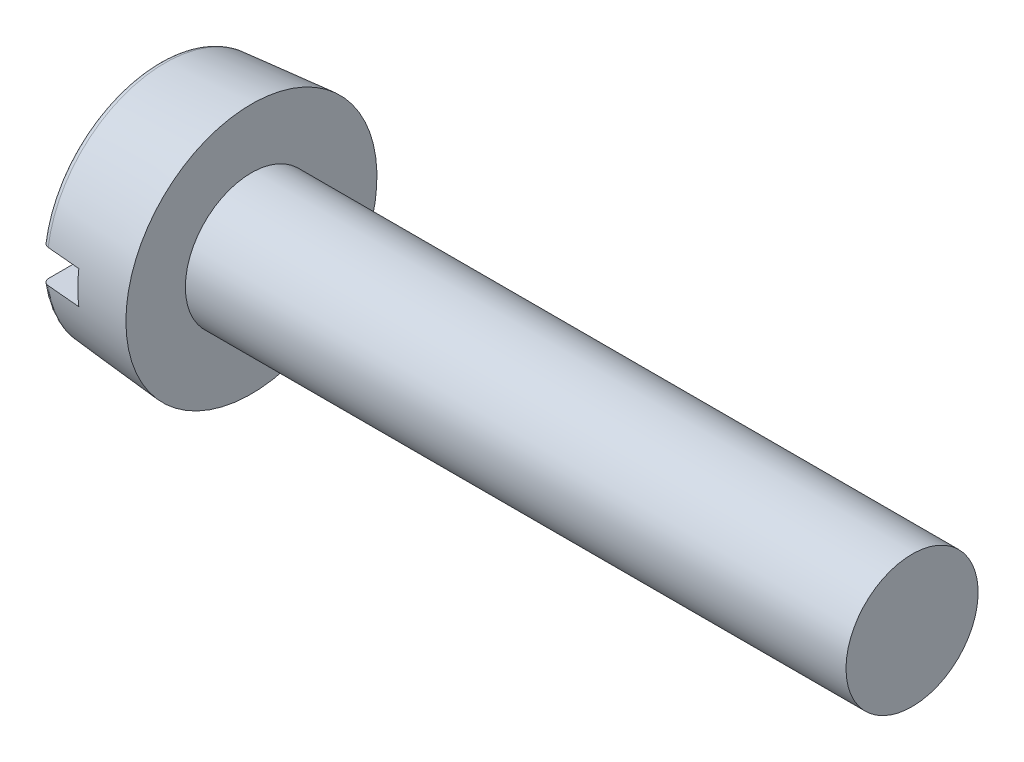
ISO-10303-21;
HEADER;
FILE_DESCRIPTION(('STEP AP214'),'2;1');
FILE_NAME('part.step','',(''),(''),'','','');
FILE_SCHEMA(('AUTOMOTIVE_DESIGN { 1 0 10303 214 1 1 1 1 }'));
ENDSEC;
DATA;
#1=APPLICATION_CONTEXT('core data for automotive mechanical design processes');
#2=APPLICATION_PROTOCOL_DEFINITION('international standard','automotive_design',2000,#1);
#3=PRODUCT_CONTEXT('',#1,'mechanical');
#4=PRODUCT('Part','Part','',(#3));
#5=PRODUCT_RELATED_PRODUCT_CATEGORY('part','',(#4));
#6=PRODUCT_DEFINITION_FORMATION('','',#4);
#7=PRODUCT_DEFINITION_CONTEXT('part definition',#1,'design');
#8=PRODUCT_DEFINITION('design','',#6,#7);
#9=PRODUCT_DEFINITION_SHAPE('','',#8);
#10=(LENGTH_UNIT() NAMED_UNIT(*) SI_UNIT(.MILLI.,.METRE.));
#11=(NAMED_UNIT(*) PLANE_ANGLE_UNIT() SI_UNIT($,.RADIAN.));
#12=(NAMED_UNIT(*) SI_UNIT($,.STERADIAN.) SOLID_ANGLE_UNIT());
#13=UNCERTAINTY_MEASURE_WITH_UNIT(LENGTH_MEASURE(1.E-05),#10,'distance_accuracy_value','');
#14=(GEOMETRIC_REPRESENTATION_CONTEXT(3) GLOBAL_UNCERTAINTY_ASSIGNED_CONTEXT((#13)) GLOBAL_UNIT_ASSIGNED_CONTEXT((#10,
#11,#12)) REPRESENTATION_CONTEXT('',''));
#15=CARTESIAN_POINT('',(0.,0.,0.));
#16=DIRECTION('',(0.,0.,1.));
#17=DIRECTION('',(1.,0.,0.));
#18=AXIS2_PLACEMENT_3D('',#15,#16,#17);
#19=CARTESIAN_POINT('',(0.,0.,0.));
#20=DIRECTION('',(-1.,0.,0.));
#21=DIRECTION('',(0.,0.,1.));
#22=AXIS2_PLACEMENT_3D('',#19,#20,#21);
#23=PLANE('',#22);
#24=DIRECTION('',(0.,0.,-1.));
#25=VECTOR('',#24,1.);
#26=CARTESIAN_POINT('',(0.,0.25,1.9));
#27=LINE('',#26,#25);
#28=CARTESIAN_POINT('',(0.,0.25,1.66724343126456));
#29=VERTEX_POINT('',#28);
#30=CARTESIAN_POINT('',(0.,0.25,-1.66724343126456));
#31=VERTEX_POINT('',#30);
#32=EDGE_CURVE('E84',#29,#31,#27,.T.);
#33=ORIENTED_EDGE('',*,*,#32,.F.);
#34=CARTESIAN_POINT('',(0.,0.,0.));
#35=DIRECTION('',(-1.,0.,0.));
#36=DIRECTION('',(0.,0.,1.));
#37=AXIS2_PLACEMENT_3D('',#34,#35,#36);
#38=CIRCLE('',#37,1.68588275366196);
#39=EDGE_CURVE('E86',#29,#31,#38,.T.);
#40=ORIENTED_EDGE('',*,*,#39,.T.);
#41=EDGE_LOOP('',(#33,#40));
#42=FACE_BOUND('',#41,.T.);
#43=ADVANCED_FACE('F16',(#42),#23,.T.);
#44=CARTESIAN_POINT('',(0.1,0.,0.));
#45=DIRECTION('',(-1.,0.,0.));
#46=DIRECTION('',(0.,0.,1.));
#47=AXIS2_PLACEMENT_3D('',#44,#45,#46);
#48=TOROIDAL_SURFACE('',#47,1.68588275366196,0.1);
#49=CARTESIAN_POINT('',(0.0301239837184526,0.25,-1.73954570987134));
#50=CARTESIAN_POINT('',(0.0341122540256549,0.25,-1.74348114703535));
#51=CARTESIAN_POINT('',(0.0384332916495908,0.25,-1.74708479745269));
#52=CARTESIAN_POINT('',(0.0476215968885681,0.25,-1.75351988324919));
#53=CARTESIAN_POINT('',(0.0524894518418905,0.25,-1.75635047687334));
#54=CARTESIAN_POINT('',(0.0626321269057779,0.25,-1.7611518726827));
#55=CARTESIAN_POINT('',(0.0679068945512783,0.25,-1.76312278549305));
#56=CARTESIAN_POINT('',(0.07871224547132,0.25,-1.76614517825523));
#57=CARTESIAN_POINT('',(0.0842427666888276,0.25,-1.76719688002821));
#58=CARTESIAN_POINT('',(0.0953733944439471,0.25,-1.76834695503076));
#59=CARTESIAN_POINT('',(0.100972999637236,0.25,-1.76845018239128));
#60=CARTESIAN_POINT('',(0.112109811915657,0.25,-1.76771285537891));
#61=CARTESIAN_POINT('',(0.117647018058241,0.25,-1.76687228676909));
#62=CARTESIAN_POINT('',(0.128489803717952,0.25,-1.76427538353904));
#63=CARTESIAN_POINT('',(0.133795848010853,0.25,-1.76252098799906));
#64=CARTESIAN_POINT('',(0.14403973031954,0.25,-1.75814968615088));
#65=CARTESIAN_POINT('',(0.148977564711526,0.25,-1.75553277135542));
#66=CARTESIAN_POINT('',(0.15836674169469,0.25,-1.74950124280131));
#67=CARTESIAN_POINT('',(0.162816088565465,0.25,-1.74608352334629));
#68=CARTESIAN_POINT('',(0.171083921068068,0.25,-1.73855542384798));
#69=CARTESIAN_POINT('',(0.174902382724926,0.25,-1.73444501749311));
#70=CARTESIAN_POINT('',(0.181835504151915,0.25,-1.72561114445745));
#71=CARTESIAN_POINT('',(0.184943867145123,0.25,-1.72088273649891));
#72=CARTESIAN_POINT('',(0.190331805109599,0.25,-1.71097526726483));
#73=CARTESIAN_POINT('',(0.19261133485436,0.25,-1.7057961814165));
#74=CARTESIAN_POINT('',(0.19630050346213,0.25,-1.69507883946751));
#75=CARTESIAN_POINT('',(0.197701208750648,0.25,-1.68953750769915));
#76=CARTESIAN_POINT('',(0.199560107931746,0.25,-1.67829891478366));
#77=CARTESIAN_POINT('',(0.200018256978501,0.25,-1.67260164623029));
#78=CARTESIAN_POINT('',(0.199980488082452,0.25,-1.66116755240173));
#79=CARTESIAN_POINT('',(0.199477416691625,0.25,-1.65543074959807));
#80=CARTESIAN_POINT('',(0.197516883099685,0.25,-1.64412247089109));
#81=CARTESIAN_POINT('',(0.19605940106392,0.25,-1.6385509984262));
#82=CARTESIAN_POINT('',(0.192226434881595,0.25,-1.62772407078967));
#83=CARTESIAN_POINT('',(0.189849634285873,0.25,-1.62246908134511));
#84=CARTESIAN_POINT('',(0.184242507962168,0.25,-1.61243590232117));
#85=CARTESIAN_POINT('',(0.181012200803495,0.25,-1.60765770237164));
#86=CARTESIAN_POINT('',(0.173808398364609,0.25,-1.59874552852762));
#87=CARTESIAN_POINT('',(0.169839413654341,0.25,-1.59460791001411));
#88=CARTESIAN_POINT('',(0.161256212040593,0.25,-1.58706689346002));
#89=CARTESIAN_POINT('',(0.156642033668647,0.25,-1.58366345160462));
#90=CARTESIAN_POINT('',(0.146954193747203,0.25,-1.57772830420901));
#91=CARTESIAN_POINT('',(0.141886222152689,0.25,-1.57518731173971));
#92=CARTESIAN_POINT('',(0.131392256265676,0.25,-1.57100326499133));
#93=CARTESIAN_POINT('',(0.125966286684049,0.25,-1.5693601488087));
#94=CARTESIAN_POINT('',(0.114975418023079,0.25,-1.56703614777695));
#95=CARTESIAN_POINT('',(0.109412743361664,0.25,-1.56634473553344));
#96=CARTESIAN_POINT('',(0.0982506296477884,0.25,-1.56591134324024));
#97=CARTESIAN_POINT('',(0.0926511921124148,0.25,-1.56616932425487));
#98=CARTESIAN_POINT('',(0.0816068018037831,0.25,-1.56762261837648));
#99=CARTESIAN_POINT('',(0.0761611699810637,0.25,-1.56881278083002));
#100=CARTESIAN_POINT('',(0.0655461187744445,0.25,-1.57208782392461));
#101=CARTESIAN_POINT('',(0.0603767005480554,0.25,-1.5741727083148));
#102=CARTESIAN_POINT('',(0.0504429211594085,0.25,-1.57918218125947));
#103=CARTESIAN_POINT('',(0.045679818847785,0.25,-1.58210926476463));
#104=CARTESIAN_POINT('',(0.0367063855830668,0.25,-1.58871421123321));
#105=CARTESIAN_POINT('',(0.0324960808997951,0.25,-1.59239210985535));
#106=CARTESIAN_POINT('',(0.0247028499071558,0.25,-1.60043217731811));
#107=CARTESIAN_POINT('',(0.0211264966781289,0.25,-1.60480071638002));
#108=CARTESIAN_POINT('',(0.0147478039662312,0.25,-1.61407035663433));
#109=CARTESIAN_POINT('',(0.0119455146325413,0.25,-1.61897149230335));
#110=CARTESIAN_POINT('',(0.00716047536747468,0.25,-1.62922901712882));
#111=CARTESIAN_POINT('',(0.0051877301006121,0.25,-1.6345900743117));
#112=CARTESIAN_POINT('',(0.00216211004761551,0.25,-1.64556559292559));
#113=CARTESIAN_POINT('',(0.00110924708522813,0.25,-1.6511800576128));
#114=CARTESIAN_POINT('',(-5.33425649796369E-05,0.25,-1.66255157007252));
#115=CARTESIAN_POINT('',(-0.00015541761931153,0.25,-1.6683094013264));
#116=CARTESIAN_POINT('',(0.000607195995681152,0.25,-1.67976235656453));
#117=CARTESIAN_POINT('',(0.00147213868127263,0.25,-1.68545746367547));
#118=CARTESIAN_POINT('',(0.0041486989547704,0.25,-1.69663068032758));
#119=CARTESIAN_POINT('',(0.00596193608673298,0.25,-1.70210840133309));
#120=CARTESIAN_POINT('',(0.0104866705202574,0.25,-1.71267417663621));
#121=CARTESIAN_POINT('',(0.0131970742616456,0.25,-1.71776269608293));
#122=CARTESIAN_POINT('',(0.0183021368753954,0.25,-1.72564874312836));
#123=CARTESIAN_POINT('',(0.0204534266755828,0.25,-1.72860667972899));
#124=CARTESIAN_POINT('',(0.0250639712199918,0.25,-1.73427200964239));
#125=CARTESIAN_POINT('',(0.0275232249959101,0.25,-1.73697940374288));
#126=CARTESIAN_POINT('',(0.0301239837184526,0.25,-1.73954570987134));
#127=B_SPLINE_CURVE_WITH_KNOTS('',3,(#49,#50,#51,#52,#53,#54,#55,#56,#57,#58,#59,#60,#61,#62,
#63,#64,#65,#66,#67,#68,#69,#70,#71,#72,#73,#74,#75,#76,#77,#78,#79,#80,#81,#82,#83,#84,#85,#86,
#87,#88,#89,#90,#91,#92,#93,#94,#95,#96,#97,#98,#99,#100,#101,#102,#103,#104,#105,#106,#107,
#108,#109,#110,#111,#112,#113,#114,#115,#116,#117,#118,#119,#120,#121,#122,#123,#124,#125,#126),
.UNSPECIFIED.,.T.,.F.,(4,2,2,2,2,2,2,2,2,2,2,2,2,2,2,2,2,2,2,2,2,2,2,2,2,2,2,2,2,2,2,2,2,2,2,2,
2,2,4),(0.,0.0167959110445539,0.0336100383184074,0.0504220012837814,0.0672299061172477,
0.0839517427346652,0.100673831600296,0.117360580985523,0.134047494574589,0.15080022732311,
0.167553596564518,0.184450209981752,0.201347745249248,0.21841437976708,0.235481826278522,
0.252676784421207,0.269872099922448,0.28709213054496,0.304311786550837,0.321429553193154,
0.338546297983665,0.355472401973106,0.372397338855155,0.389133511649819,0.405868998082987,
0.422512661437949,0.439156394534983,0.455849950224764,0.472544298931967,0.489402732254279,
0.506262257525771,0.523319657239101,0.540377276197225,0.557572051898687,0.574771345386102,
0.592000109063807,0.609207949388035,0.620160629655459,0.631113275486231),.UNSPECIFIED.);
#128=CARTESIAN_POINT('',(0.0912844257252333,0.25,-1.76791351316188));
#129=VERTEX_POINT('',#128);
#130=EDGE_CURVE('E40',#31,#129,#127,.T.);
#131=ORIENTED_EDGE('',*,*,#130,.F.);
#132=ORIENTED_EDGE('',*,*,#39,.F.);
#133=CARTESIAN_POINT('',(0.038410820052543,0.25,1.58753563015566));
#134=CARTESIAN_POINT('',(0.0427902939890945,0.25,1.58407005650774));
#135=CARTESIAN_POINT('',(0.0474630469549891,0.25,1.58096901798646));
#136=CARTESIAN_POINT('',(0.057265743991553,0.25,1.57559125576911));
#137=CARTESIAN_POINT('',(0.0623961680717354,0.25,1.57331541051488));
#138=CARTESIAN_POINT('',(0.0729671844638347,0.25,1.56966008382672));
#139=CARTESIAN_POINT('',(0.0784077499033303,0.25,1.56828052486143));
#140=CARTESIAN_POINT('',(0.0894424523036429,0.25,1.56646066317196));
#141=CARTESIAN_POINT('',(0.0950365520436793,0.25,1.56602013480384));
#142=CARTESIAN_POINT('',(0.106187916851424,0.25,1.56609100566934));
#143=CARTESIAN_POINT('',(0.111745215600338,0.25,1.56659719462549));
#144=CARTESIAN_POINT('',(0.122695887603688,0.25,1.56853573821628));
#145=CARTESIAN_POINT('',(0.128089257112214,0.25,1.56996811399837));
#146=CARTESIAN_POINT('',(0.138558934280523,0.25,1.57371510963342));
#147=CARTESIAN_POINT('',(0.143635299693182,0.25,1.57602956823661));
#148=CARTESIAN_POINT('',(0.153331512379457,0.25,1.58147155156435));
#149=CARTESIAN_POINT('',(0.15795134553212,0.25,1.58459910142768));
#150=CARTESIAN_POINT('',(0.166642844689646,0.25,1.59160307133552));
#151=CARTESIAN_POINT('',(0.170709973240089,0.25,1.59548512047214));
#152=CARTESIAN_POINT('',(0.17814400538551,0.25,1.60386991016736));
#153=CARTESIAN_POINT('',(0.181510868111661,0.25,1.6083726869273));
#154=CARTESIAN_POINT('',(0.18749050008726,0.25,1.61792751523024));
#155=CARTESIAN_POINT('',(0.190093987175764,0.25,1.62298537603827));
#156=CARTESIAN_POINT('',(0.194424575068899,0.25,1.63346332336008));
#157=CARTESIAN_POINT('',(0.196151623655145,0.25,1.63888343143487));
#158=CARTESIAN_POINT('',(0.19869656706418,0.25,1.64999030292114));
#159=CARTESIAN_POINT('',(0.19950519348372,0.25,1.65567919157282));
#160=CARTESIAN_POINT('',(0.200160111365204,0.25,1.66711218979157));
#161=CARTESIAN_POINT('',(0.200006372625092,0.25,1.67285630108605));
#162=CARTESIAN_POINT('',(0.198737358913371,0.25,1.68426056047317));
#163=CARTESIAN_POINT('',(0.197618277112315,0.25,1.68992028578478));
#164=CARTESIAN_POINT('',(0.194442698747917,0.25,1.70097049473464));
#165=CARTESIAN_POINT('',(0.192386209487117,0.25,1.70636098046993));
#166=CARTESIAN_POINT('',(0.187399427297265,0.25,1.7166994325418));
#167=CARTESIAN_POINT('',(0.18447206309478,0.25,1.72164881093218));
#168=CARTESIAN_POINT('',(0.177821112560516,0.25,1.73098021623841));
#169=CARTESIAN_POINT('',(0.174097559800524,0.25,1.73536226706347));
#170=CARTESIAN_POINT('',(0.165993769608675,0.25,1.74339353418512));
#171=CARTESIAN_POINT('',(0.161619482864613,0.25,1.74704875411543));
#172=CARTESIAN_POINT('',(0.152314080979336,0.25,1.75356401214195));
#173=CARTESIAN_POINT('',(0.147382997277304,0.25,1.75642409510351));
#174=CARTESIAN_POINT('',(0.137157313470634,0.25,1.76123793804064));
#175=CARTESIAN_POINT('',(0.131866864335231,0.25,1.76320051691167));
#176=CARTESIAN_POINT('',(0.121030177928266,0.25,1.7662021188539));
#177=CARTESIAN_POINT('',(0.115483952770112,0.25,1.76724118561497));
#178=CARTESIAN_POINT('',(0.10433726421861,0.25,1.76836005573213));
#179=CARTESIAN_POINT('',(0.0987375081693256,0.25,1.76844691644335));
#180=CARTESIAN_POINT('',(0.0876033192585389,0.25,1.76767711814466));
#181=CARTESIAN_POINT('',(0.0820688850795546,0.25,1.76682047819726));
#182=CARTESIAN_POINT('',(0.0712339359121825,0.25,1.76419215705386));
#183=CARTESIAN_POINT('',(0.0659329644744121,0.25,1.76242235604695));
#184=CARTESIAN_POINT('',(0.0557017028644441,0.25,1.75802135089928));
#185=CARTESIAN_POINT('',(0.0507714167878425,0.25,1.75539013724273));
#186=CARTESIAN_POINT('',(0.0413993898846342,0.25,1.74933132383135));
#187=CARTESIAN_POINT('',(0.0369596773547095,0.25,1.74590058763537));
#188=CARTESIAN_POINT('',(0.0287131089970528,0.25,1.73834824703872));
#189=CARTESIAN_POINT('',(0.024906279451321,0.25,1.73422661396116));
#190=CARTESIAN_POINT('',(0.0179981143560021,0.25,1.72537218244404));
#191=CARTESIAN_POINT('',(0.0149031090922599,0.25,1.72063444579746));
#192=CARTESIAN_POINT('',(0.00954325096840195,0.25,1.71071066098417));
#193=CARTESIAN_POINT('',(0.00727844426054889,0.25,1.70552458791341));
#194=CARTESIAN_POINT('',(0.00361981721141334,0.25,1.69479566620519));
#195=CARTESIAN_POINT('',(0.00223495300327865,0.25,1.68924976295691));
#196=CARTESIAN_POINT('',(0.000408375366709955,0.25,1.67800493025775));
#197=CARTESIAN_POINT('',(-3.33291319022026E-05,0.25,1.67230599935852));
#198=CARTESIAN_POINT('',(3.75123327413426E-05,0.25,1.66087218591111));
#199=CARTESIAN_POINT('',(0.000557074784948403,0.25,1.65513734594056));
#200=CARTESIAN_POINT('',(0.00255033342308904,0.25,1.64383422369473));
#201=CARTESIAN_POINT('',(0.00402428246581611,0.25,1.63826598596849));
#202=CARTESIAN_POINT('',(0.00788999970877076,0.25,1.62744650084935));
#203=CARTESIAN_POINT('',(0.010283460246834,0.25,1.62219585873013));
#204=CARTESIAN_POINT('',(0.0159217046243911,0.25,1.61217899485774));
#205=CARTESIAN_POINT('',(0.0191654522683323,0.25,1.607412193218));
#206=CARTESIAN_POINT('',(0.0251008031700797,0.25,1.60011257766084));
#207=CARTESIAN_POINT('',(0.0275686339076157,0.25,1.59739475707804));
#208=CARTESIAN_POINT('',(0.032785764913995,0.25,1.59224410808593));
#209=CARTESIAN_POINT('',(0.0355350642370452,0.25,1.58981127871903));
#210=CARTESIAN_POINT('',(0.038410820052543,0.25,1.58753563015566));
#211=B_SPLINE_CURVE_WITH_KNOTS('',3,(#133,#134,#135,#136,#137,#138,#139,#140,#141,#142,#143,
#144,#145,#146,#147,#148,#149,#150,#151,#152,#153,#154,#155,#156,#157,#158,#159,#160,#161,#162,
#163,#164,#165,#166,#167,#168,#169,#170,#171,#172,#173,#174,#175,#176,#177,#178,#179,#180,#181,
#182,#183,#184,#185,#186,#187,#188,#189,#190,#191,#192,#193,#194,#195,#196,#197,#198,#199,#200,
#201,#202,#203,#204,#205,#206,#207,#208,#209,#210),.UNSPECIFIED.,.T.,.F.,(4,2,2,2,2,2,2,2,2,2,2,
2,2,2,2,2,2,2,2,2,2,2,2,2,2,2,2,2,2,2,2,2,2,2,2,2,2,2,4),(0.,0.0167411910060388,
0.0335001515260854,0.0502576621545573,0.0670111455902049,0.0836726971117868,0.100334629076978,
0.116993516605717,0.133652919247716,0.150441746179843,0.167231552664631,0.18421776717599,
0.201204993610686,0.218362167205904,0.235519879250061,0.252745563649484,0.269971113860592,
0.287139377595869,0.304306917563327,0.321326154497721,0.338344430931905,0.355191689226128,
0.37203815046139,0.388759667571552,0.405480846845857,0.422167733967672,0.438854805431025,
0.455608474446361,0.472362839024727,0.489260888718256,0.506159877662992,0.523228221442543,
0.540296726824198,0.557490310608038,0.574688451553918,0.591918398070691,0.609127444285945,
0.620120485883898,0.631113490544153),.UNSPECIFIED.);
#212=CARTESIAN_POINT('',(0.0912844257209469,0.25,1.76791351317857));
#213=VERTEX_POINT('',#212);
#214=EDGE_CURVE('E76',#213,#29,#211,.T.);
#215=ORIENTED_EDGE('',*,*,#214,.F.);
#216=CARTESIAN_POINT('',(0.0912844257252333,0.,0.));
#217=DIRECTION('',(-1.,0.,0.));
#218=DIRECTION('',(0.,0.,1.));
#219=AXIS2_PLACEMENT_3D('',#216,#217,#218);
#220=CIRCLE('',#219,1.78550222347114);
#221=EDGE_CURVE('E90',#129,#213,#220,.F.);
#222=ORIENTED_EDGE('',*,*,#221,.F.);
#223=EDGE_LOOP('',(#131,#132,#215,#222));
#224=FACE_BOUND('',#223,.T.);
#225=ADVANCED_FACE('F167',(#224),#48,.T.);
#226=CARTESIAN_POINT('',(-25.4,0.,0.));
#227=DIRECTION('',(-1.,0.,0.));
#228=DIRECTION('',(0.,0.,1.));
#229=AXIS2_PLACEMENT_3D('',#226,#227,#228);
#230=CYLINDRICAL_SURFACE('',#229,1.);
#231=CARTESIAN_POINT('',(11.4,0.,0.));
#232=DIRECTION('',(-1.,0.,0.));
#233=DIRECTION('',(0.,0.,1.));
#234=AXIS2_PLACEMENT_3D('',#231,#232,#233);
#235=CIRCLE('',#234,1.);
#236=CARTESIAN_POINT('',(11.4,0.,1.));
#237=VERTEX_POINT('',#236);
#238=EDGE_CURVE('E87',#237,#237,#235,.T.);
#239=ORIENTED_EDGE('',*,*,#238,.T.);
#240=EDGE_LOOP('',(#239));
#241=FACE_BOUND('',#240,.T.);
#242=CARTESIAN_POINT('',(1.4,0.,0.));
#243=DIRECTION('',(-1.,0.,0.));
#244=DIRECTION('',(0.,0.,1.));
#245=AXIS2_PLACEMENT_3D('',#242,#243,#244);
#246=CIRCLE('',#245,1.);
#247=CARTESIAN_POINT('',(1.4,0.,1.));
#248=VERTEX_POINT('',#247);
#249=EDGE_CURVE('E154',#248,#248,#246,.T.);
#250=ORIENTED_EDGE('',*,*,#249,.F.);
#251=EDGE_LOOP('',(#250));
#252=FACE_BOUND('',#251,.T.);
#253=ADVANCED_FACE('F164',(#241,#252),#230,.T.);
#254=CARTESIAN_POINT('',(11.4,1.,0.));
#255=DIRECTION('',(1.,0.,0.));
#256=DIRECTION('',(0.,0.,-1.));
#257=AXIS2_PLACEMENT_3D('',#254,#255,#256);
#258=PLANE('',#257);
#259=ORIENTED_EDGE('',*,*,#238,.F.);
#260=EDGE_LOOP('',(#259));
#261=FACE_BOUND('',#260,.T.);
#262=ADVANCED_FACE('F166',(#261),#258,.T.);
#263=DIRECTION('',(0.,0.,1.));
#264=VECTOR('',#263,1.);
#265=CARTESIAN_POINT('',(0.,-0.25,-1.9));
#266=LINE('',#265,#264);
#267=CARTESIAN_POINT('',(0.,-0.25,-1.66724343126456));
#268=VERTEX_POINT('',#267);
#269=CARTESIAN_POINT('',(0.,-0.25,1.66724343126456));
#270=VERTEX_POINT('',#269);
#271=EDGE_CURVE('E32',#268,#270,#266,.T.);
#272=ORIENTED_EDGE('',*,*,#271,.F.);
#273=EDGE_CURVE('E82',#268,#270,#38,.T.);
#274=ORIENTED_EDGE('',*,*,#273,.T.);
#275=EDGE_LOOP('',(#272,#274));
#276=FACE_BOUND('',#275,.T.);
#277=ADVANCED_FACE('F81',(#276),#23,.T.);
#278=CARTESIAN_POINT('',(0.,0.,0.));
#279=DIRECTION('',(1.,0.,0.));
#280=DIRECTION('',(0.,0.,-1.));
#281=AXIS2_PLACEMENT_3D('',#278,#279,#280);
#282=CONICAL_SURFACE('',#281,1.7775158710637,0.0872664625997165);
#283=CARTESIAN_POINT('',(3.6210781881066,0.25,2.07934430853245));
#284=CARTESIAN_POINT('',(3.06980125604964,0.25,2.03076587392467));
#285=CARTESIAN_POINT('',(2.51852633750628,0.25,1.98216457470873));
#286=CARTESIAN_POINT('',(1.41598182372261,0.25,1.88490176224617));
#287=CARTESIAN_POINT('',(0.86471222848219,0.25,1.83624024900076));
#288=CARTESIAN_POINT('',(-0.237820369493235,0.25,1.7388425212793));
#289=CARTESIAN_POINT('',(-0.789083372228187,0.25,1.69010630680258));
#290=CARTESIAN_POINT('',(-1.89160065704932,0.25,1.59253521876817));
#291=CARTESIAN_POINT('',(-2.44285493913533,0.25,1.54370034520849));
#292=CARTESIAN_POINT('',(-2.99410378813087,0.25,1.49480416395094));
#293=B_SPLINE_CURVE_WITH_KNOTS('',3,(#283,#284,#285,#286,#287,#288,#289,#290,#291,#292),
.UNSPECIFIED.,.F.,.F.,(4,2,2,2,4),(0.,1.66023946632278,3.32047889930815,4.98071834715392,
6.64095782861457),.UNSPECIFIED.);
#294=CARTESIAN_POINT('',(0.6,0.25,1.8128522259904));
#295=VERTEX_POINT('',#294);
#296=EDGE_CURVE('E143',#295,#213,#293,.T.);
#297=ORIENTED_EDGE('',*,*,#296,.F.);
#298=CARTESIAN_POINT('',(0.6,0.,0.));
#299=DIRECTION('',(1.,0.,0.));
#300=DIRECTION('',(0.,0.,-1.));
#301=AXIS2_PLACEMENT_3D('',#298,#299,#300);
#302=CIRCLE('',#301,1.83000906917926);
#303=CARTESIAN_POINT('',(0.6,-0.25,1.8128522259904));
#304=VERTEX_POINT('',#303);
#305=EDGE_CURVE('E11',#304,#295,#302,.F.);
#306=ORIENTED_EDGE('',*,*,#305,.F.);
#307=CARTESIAN_POINT('',(-2.99410378813087,-0.25,1.49480416395094));
#308=CARTESIAN_POINT('',(-2.06836137178344,-0.25,1.57691372931173));
#309=CARTESIAN_POINT('',(-1.14260434025588,-0.25,1.65885820727605));
#310=CARTESIAN_POINT('',(-0.0400762748424803,-0.25,1.75630736694366));
#311=CARTESIAN_POINT('',(0.136684651711361,-0.25,1.77192637736924));
#312=CARTESIAN_POINT('',(1.41597857948217,-0.25,1.88493859856276));
#313=CARTESIAN_POINT('',(2.51852498766332,-0.25,1.98218009580805));
#314=CARTESIAN_POINT('',(3.6210781881066,-0.25,2.07934430853245));
#315=B_SPLINE_CURVE_WITH_KNOTS('',3,(#307,#308,#309,#310,#311,#312,#313,#314),.UNSPECIFIED.,.F.,
.F.,(4,2,2,4),(0.,2.78812996950874,3.32047892237668,6.64095781673274),.UNSPECIFIED.);
#316=CARTESIAN_POINT('',(0.0912844257252334,-0.25,1.76791351316188));
#317=VERTEX_POINT('',#316);
#318=EDGE_CURVE('E119',#317,#304,#315,.T.);
#319=ORIENTED_EDGE('',*,*,#318,.F.);
#320=CARTESIAN_POINT('',(0.091284425720508,-0.25,-1.76791351318017));
#321=VERTEX_POINT('',#320);
#322=EDGE_CURVE('E96',#317,#321,#220,.F.);
#323=ORIENTED_EDGE('',*,*,#322,.T.);
#324=CARTESIAN_POINT('',(3.6210781881066,-0.25,-2.07934430853245));
#325=CARTESIAN_POINT('',(3.06980125604964,-0.25,-2.03076587392467));
#326=CARTESIAN_POINT('',(2.51852633750628,-0.25,-1.98216457470873));
#327=CARTESIAN_POINT('',(1.41598182372261,-0.25,-1.88490176224617));
#328=CARTESIAN_POINT('',(0.86471222848219,-0.25,-1.83624024900076));
#329=CARTESIAN_POINT('',(-0.237820369493235,-0.25,-1.7388425212793));
#330=CARTESIAN_POINT('',(-0.789083372228187,-0.25,-1.69010630680258));
#331=CARTESIAN_POINT('',(-1.89160065704932,-0.25,-1.59253521876817));
#332=CARTESIAN_POINT('',(-2.44285493913533,-0.25,-1.54370034520849));
#333=CARTESIAN_POINT('',(-2.99410378813087,-0.25,-1.49480416395094));
#334=B_SPLINE_CURVE_WITH_KNOTS('',3,(#324,#325,#326,#327,#328,#329,#330,#331,#332,#333),
.UNSPECIFIED.,.F.,.F.,(4,2,2,2,4),(0.,1.66023946632278,3.32047889930815,4.98071834715392,
6.64095782861457),.UNSPECIFIED.);
#335=CARTESIAN_POINT('',(0.6,-0.25,-1.8128522259904));
#336=VERTEX_POINT('',#335);
#337=EDGE_CURVE('E71',#336,#321,#334,.T.);
#338=ORIENTED_EDGE('',*,*,#337,.F.);
#339=CARTESIAN_POINT('',(0.6,0.25,-1.8128522259904));
#340=VERTEX_POINT('',#339);
#341=EDGE_CURVE('E21',#340,#336,#302,.F.);
#342=ORIENTED_EDGE('',*,*,#341,.F.);
#343=CARTESIAN_POINT('',(-2.99410378813087,0.25,-1.49480416395094));
#344=CARTESIAN_POINT('',(-2.06836137178344,0.25,-1.57691372931173));
#345=CARTESIAN_POINT('',(-1.14260434025588,0.25,-1.65885820727605));
#346=CARTESIAN_POINT('',(-0.0400762748424803,0.25,-1.75630736694366));
#347=CARTESIAN_POINT('',(0.136684651711361,0.25,-1.77192637736924));
#348=CARTESIAN_POINT('',(1.41597857948217,0.25,-1.88493859856276));
#349=CARTESIAN_POINT('',(2.51852498766332,0.25,-1.98218009580805));
#350=CARTESIAN_POINT('',(3.6210781881066,0.25,-2.07934430853245));
#351=B_SPLINE_CURVE_WITH_KNOTS('',3,(#343,#344,#345,#346,#347,#348,#349,#350),.UNSPECIFIED.,.F.,
.F.,(4,2,2,4),(0.,2.78812996950874,3.32047892237668,6.64095781673274),.UNSPECIFIED.);
#352=EDGE_CURVE('E148',#129,#340,#351,.T.);
#353=ORIENTED_EDGE('',*,*,#352,.F.);
#354=ORIENTED_EDGE('',*,*,#221,.T.);
#355=EDGE_LOOP('',(#297,#306,#319,#323,#338,#342,#353,#354));
#356=FACE_BOUND('',#355,.T.);
#357=CARTESIAN_POINT('',(1.4,0.,0.));
#358=DIRECTION('',(-1.,0.,0.));
#359=DIRECTION('',(0.,0.,1.));
#360=AXIS2_PLACEMENT_3D('',#357,#358,#359);
#361=CIRCLE('',#360,1.9);
#362=CARTESIAN_POINT('',(1.4,0.,1.9));
#363=VERTEX_POINT('',#362);
#364=EDGE_CURVE('E92',#363,#363,#361,.T.);
#365=ORIENTED_EDGE('',*,*,#364,.T.);
#366=EDGE_LOOP('',(#365));
#367=FACE_BOUND('',#366,.T.);
#368=ADVANCED_FACE('F132',(#356,#367),#282,.T.);
#369=CARTESIAN_POINT('',(1.4,1.,0.));
#370=DIRECTION('',(-1.,0.,0.));
#371=DIRECTION('',(0.,0.,1.));
#372=AXIS2_PLACEMENT_3D('',#369,#370,#371);
#373=PLANE('',#372);
#374=ORIENTED_EDGE('',*,*,#364,.F.);
#375=EDGE_LOOP('',(#374));
#376=FACE_BOUND('',#375,.T.);
#377=ORIENTED_EDGE('',*,*,#249,.T.);
#378=EDGE_LOOP('',(#377));
#379=FACE_BOUND('',#378,.T.);
#380=ADVANCED_FACE('F136',(#376,#379),#373,.F.);
#381=CARTESIAN_POINT('',(0.0301239837184526,-0.25,-1.73954570987134));
#382=CARTESIAN_POINT('',(0.0260780259282707,-0.25,-1.7355526396478));
#383=CARTESIAN_POINT('',(0.0223687128122033,-0.25,-1.73121218004399));
#384=CARTESIAN_POINT('',(0.0157302639131424,-0.25,-1.72196511132148));
#385=CARTESIAN_POINT('',(0.0128021718532189,-0.25,-1.71705775723464));
#386=CARTESIAN_POINT('',(0.0078115596339449,-0.25,-1.70682606234138));
#387=CARTESIAN_POINT('',(0.00574827888609249,-0.25,-1.70150209285375));
#388=CARTESIAN_POINT('',(0.0025389033246811,-0.25,-1.69058637396543));
#389=CARTESIAN_POINT('',(0.00139257748788429,-0.25,-1.68499469239027));
#390=CARTESIAN_POINT('',(4.10282908945426E-05,-0.25,-1.6736612271434));
#391=CARTESIAN_POINT('',(-0.000157937515953973,-0.25,-1.66791869666335));
#392=CARTESIAN_POINT('',(0.000406868333239566,-0.25,-1.65648081813977));
#393=CARTESIAN_POINT('',(0.00117071281055931,-0.25,-1.6507854736979));
#394=CARTESIAN_POINT('',(0.00364543682274085,-0.25,-1.63958072861034));
#395=CARTESIAN_POINT('',(0.00536002222944807,-0.25,-1.63407214566351));
#396=CARTESIAN_POINT('',(0.00969258991345517,-0.25,-1.62342232819609));
#397=CARTESIAN_POINT('',(0.0123105654239292,-0.25,-1.61828109092426));
#398=CARTESIAN_POINT('',(0.0183686871454059,-0.25,-1.60853152324288));
#399=CARTESIAN_POINT('',(0.0218060998642178,-0.25,-1.60392149509216));
#400=CARTESIAN_POINT('',(0.02941306181309,-0.25,-1.59535108561564));
#401=CARTESIAN_POINT('',(0.033582574319999,-0.25,-1.59139067172354));
#402=CARTESIAN_POINT('',(0.0424928099447958,-0.25,-1.58427405023075));
#403=CARTESIAN_POINT('',(0.047227590966096,-0.25,-1.58111040437777));
#404=CARTESIAN_POINT('',(0.0571661220583322,-0.25,-1.57563408783813));
#405=CARTESIAN_POINT('',(0.0623698398595656,-0.25,-1.57332135865154));
#406=CARTESIAN_POINT('',(0.0730321903589694,-0.25,-1.56964075335714));
#407=CARTESIAN_POINT('',(0.0784870693494756,-0.25,-1.5682620002125));
#408=CARTESIAN_POINT('',(0.0895514615468667,-0.25,-1.56644822093411));
#409=CARTESIAN_POINT('',(0.095160966176,-0.25,-1.56601314255693));
#410=CARTESIAN_POINT('',(0.106327002489757,-0.25,-1.56609980469677));
#411=CARTESIAN_POINT('',(0.111883595726444,-0.25,-1.56661383635248));
#412=CARTESIAN_POINT('',(0.122831388816505,-0.25,-1.56856777941325));
#413=CARTESIAN_POINT('',(0.128222590680129,-0.25,-1.57000767956016));
#414=CARTESIAN_POINT('',(0.138686958017419,-0.25,-1.57376928649222));
#415=CARTESIAN_POINT('',(0.143760167134577,-0.25,-1.57609087195876));
#416=CARTESIAN_POINT('',(0.153448951544548,-0.25,-1.58154646534634));
#417=CARTESIAN_POINT('',(0.158064511721778,-0.25,-1.58468050008924));
#418=CARTESIAN_POINT('',(0.166746542197498,-0.25,-1.59169675607619));
#419=CARTESIAN_POINT('',(0.170808452559137,-0.25,-1.59558461824979));
#420=CARTESIAN_POINT('',(0.178231167530173,-0.25,-1.60398009132926));
#421=CARTESIAN_POINT('',(0.181591930079706,-0.25,-1.60848773938745));
#422=CARTESIAN_POINT('',(0.187558577382552,-0.25,-1.61805131058344));
#423=CARTESIAN_POINT('',(0.190155167963793,-0.25,-1.62311303257518));
#424=CARTESIAN_POINT('',(0.194471398021903,-0.25,-1.63359750325318));
#425=CARTESIAN_POINT('',(0.196190986225804,-0.25,-1.63902027302674));
#426=CARTESIAN_POINT('',(0.198720541525037,-0.25,-1.6501311220685));
#427=CARTESIAN_POINT('',(0.199521253042963,-0.25,-1.65582131006132));
#428=CARTESIAN_POINT('',(0.200160205109374,-0.25,-1.66725556951255));
#429=CARTESIAN_POINT('',(0.199998414852101,-0.25,-1.67299964268973));
#430=CARTESIAN_POINT('',(0.198713360352001,-0.25,-1.68440229675822));
#431=CARTESIAN_POINT('',(0.197586318442358,-0.25,-1.6900604527342));
#432=CARTESIAN_POINT('',(0.194395171653612,-0.25,-1.70110618713494));
#433=CARTESIAN_POINT('',(0.192331075364088,-0.25,-1.70649376803945));
#434=CARTESIAN_POINT('',(0.187329743049282,-0.25,-1.71682501034087));
#435=CARTESIAN_POINT('',(0.184395458897692,-0.25,-1.7217701001031));
#436=CARTESIAN_POINT('',(0.177731477244739,-0.25,-1.73109181693493));
#437=CARTESIAN_POINT('',(0.174001811840985,-0.25,-1.73546846693245));
#438=CARTESIAN_POINT('',(0.16588691119851,-0.25,-1.74348794106844));
#439=CARTESIAN_POINT('',(0.161507629441039,-0.25,-1.74713678874591));
#440=CARTESIAN_POINT('',(0.152193383444686,-0.25,-1.75363855606621));
#441=CARTESIAN_POINT('',(0.147258449475751,-0.25,-1.75649151903658));
#442=CARTESIAN_POINT('',(0.137026259848381,-0.25,-1.76129070832175));
#443=CARTESIAN_POINT('',(0.131733133431451,-0.25,-1.76324573979348));
#444=CARTESIAN_POINT('',(0.120892616958677,-0.25,-1.76623183391573));
#445=CARTESIAN_POINT('',(0.11534524913605,-0.25,-1.76726297719812));
#446=CARTESIAN_POINT('',(0.104198164295004,-0.25,-1.76836600998606));
#447=CARTESIAN_POINT('',(0.0985991525060392,-0.25,-1.76844503986814));
#448=CARTESIAN_POINT('',(0.0874662076269174,-0.25,-1.76765975687259));
#449=CARTESIAN_POINT('',(0.0819322899786185,-0.25,-1.76679522454642));
#450=CARTESIAN_POINT('',(0.0710974014185305,-0.25,-1.76415096656148));
#451=CARTESIAN_POINT('',(0.0657960842145945,-0.25,-1.76237265523513));
#452=CARTESIAN_POINT('',(0.0555703957728269,-0.25,-1.75795545669432));
#453=CARTESIAN_POINT('',(0.0506455770568972,-0.25,-1.7553176113261));
#454=CARTESIAN_POINT('',(0.0431273776562807,-0.25,-1.75044285417604));
#455=CARTESIAN_POINT('',(0.0403727951884046,-0.25,-1.74844968976037));
#456=CARTESIAN_POINT('',(0.0350800601103,-0.25,-1.74419427547474));
#457=CARTESIAN_POINT('',(0.032541906754964,-0.25,-1.74193202653123));
#458=CARTESIAN_POINT('',(0.0301239837184526,-0.25,-1.73954570987134));
#459=B_SPLINE_CURVE_WITH_KNOTS('',3,(#381,#382,#383,#384,#385,#386,#387,#388,#389,#390,#391,
#392,#393,#394,#395,#396,#397,#398,#399,#400,#401,#402,#403,#404,#405,#406,#407,#408,#409,#410,
#411,#412,#413,#414,#415,#416,#417,#418,#419,#420,#421,#422,#423,#424,#425,#426,#427,#428,#429,
#430,#431,#432,#433,#434,#435,#436,#437,#438,#439,#440,#441,#442,#443,#444,#445,#446,#447,#448,
#449,#450,#451,#452,#453,#454,#455,#456,#457,#458),.UNSPECIFIED.,.T.,.F.,(4,2,2,2,2,2,2,2,2,2,2,
2,2,2,2,2,2,2,2,2,2,2,2,2,2,2,2,2,2,2,2,2,2,2,2,2,2,2,4),(0.,0.0170411722438949,
0.0341049990186816,0.0511537867645752,0.0681982777803335,0.0853551972527325,0.102513414450955,
0.119738987255991,0.136964431036013,0.154133198727654,0.171301105455751,0.188302245400993,
0.205302216311467,0.222100636581185,0.23889812683804,0.25555978426519,0.272221239097884,
0.288880402169165,0.305540115289018,0.322329672912015,0.339120237403428,0.356107292735507,
0.373095341083044,0.390253043299336,0.407411294666675,0.424637006068489,0.441862559572752,
0.459030335786743,0.476197419326212,0.493215918450515,0.510233490915957,0.527080425228573,
0.543925889090266,0.560644941023431,0.57736788221095,0.594065017517701,0.61074198894896,
0.620926075619137,0.631110127226808),.UNSPECIFIED.);
#460=EDGE_CURVE('E67',#321,#268,#459,.T.);
#461=ORIENTED_EDGE('',*,*,#460,.F.);
#462=ORIENTED_EDGE('',*,*,#322,.F.);
#463=CARTESIAN_POINT('',(0.0384108200525428,-0.25,1.58753563015566));
#464=CARTESIAN_POINT('',(0.0339573950704053,-0.25,1.5910603658954));
#465=CARTESIAN_POINT('',(0.0298007999429177,-0.25,1.59496730933873));
#466=CARTESIAN_POINT('',(0.0222010182064344,-0.25,1.60342863634491));
#467=CARTESIAN_POINT('',(0.0187588035663531,-0.25,1.60798388796708));
#468=CARTESIAN_POINT('',(0.0126884755380012,-0.25,1.61760223594505));
#469=CARTESIAN_POINT('',(0.0100595998475483,-0.25,1.62266485084517));
#470=CARTESIAN_POINT('',(0.00568272388268391,-0.25,1.63315559353335));
#471=CARTESIAN_POINT('',(0.00393449893167441,-0.25,1.63858362769256));
#472=CARTESIAN_POINT('',(0.00135420896618528,-0.25,1.6496959787203));
#473=CARTESIAN_POINT('',(0.000529062493142359,-0.25,1.65538190290297));
#474=CARTESIAN_POINT('',(-0.000159268616023079,-0.25,1.66681204026049));
#475=CARTESIAN_POINT('',(-2.23806129211112E-05,-0.25,1.67255625780414));
#476=CARTESIAN_POINT('',(0.00121306917338658,-0.25,1.68396387537009));
#477=CARTESIAN_POINT('',(0.00231549071302684,-0.25,1.68962685820058));
#478=CARTESIAN_POINT('',(0.00545847496257945,-0.25,1.70068635267493));
#479=CARTESIAN_POINT('',(0.00749902870568401,-0.25,1.70608286686519));
#480=CARTESIAN_POINT('',(0.0124553209196925,-0.25,1.71643631844882));
#481=CARTESIAN_POINT('',(0.0153681805259003,-0.25,1.72139463336573));
#482=CARTESIAN_POINT('',(0.0219918139097572,-0.25,1.73074625136145));
#483=CARTESIAN_POINT('',(0.0257025525730674,-0.25,1.73513957929153));
#484=CARTESIAN_POINT('',(0.0337830293566341,-0.25,1.7431954661646));
#485=CARTESIAN_POINT('',(0.0381468204499056,-0.25,1.74686398949027));
#486=CARTESIAN_POINT('',(0.0474336489372372,-0.25,1.7534074422751));
#487=CARTESIAN_POINT('',(0.0523566554179295,-0.25,1.75628241557152));
#488=CARTESIAN_POINT('',(0.0625688825799932,-0.25,1.76112700539213));
#489=CARTESIAN_POINT('',(0.0678539229214079,-0.25,1.76310543520284));
#490=CARTESIAN_POINT('',(0.0786825580230985,-0.25,1.76613938813517));
#491=CARTESIAN_POINT('',(0.0842261404099091,-0.25,1.76719495537608));
#492=CARTESIAN_POINT('',(0.0953701815790085,-0.25,1.76834682813952));
#493=CARTESIAN_POINT('',(0.100969908426045,-0.25,1.7684502251156));
#494=CARTESIAN_POINT('',(0.11210681306469,-0.25,1.76771321576233));
#495=CARTESIAN_POINT('',(0.117643992150452,-0.25,1.76687282899673));
#496=CARTESIAN_POINT('',(0.128486801349998,-0.25,1.76427628463559));
#497=CARTESIAN_POINT('',(0.133792894145408,-0.25,1.76252205760683));
#498=CARTESIAN_POINT('',(0.144036912707969,-0.25,1.75815107926835));
#499=CARTESIAN_POINT('',(0.148974834149096,-0.25,1.75553431782577));
#500=CARTESIAN_POINT('',(0.15836419767094,-0.25,1.74950308538222));
#501=CARTESIAN_POINT('',(0.162813645288572,-0.25,1.74608551042966));
#502=CARTESIAN_POINT('',(0.171081709116824,-0.25,1.73855767538295));
#503=CARTESIAN_POINT('',(0.174900300331172,-0.25,1.73444738785466));
#504=CARTESIAN_POINT('',(0.18183369697909,-0.25,1.72561373225442));
#505=CARTESIAN_POINT('',(0.184942206210862,-0.25,1.72088542303857));
#506=CARTESIAN_POINT('',(0.19033044770101,-0.25,1.7109781307854));
#507=CARTESIAN_POINT('',(0.192610135624698,-0.25,1.70579912365806));
#508=CARTESIAN_POINT('',(0.19629963411489,-0.25,1.69508191169097));
#509=CARTESIAN_POINT('',(0.197700511048479,-0.25,1.68954063085116));
#510=CARTESIAN_POINT('',(0.199559761114849,-0.25,1.67830210616433));
#511=CARTESIAN_POINT('',(0.200018088664459,-0.25,1.67260485478783));
#512=CARTESIAN_POINT('',(0.19998067881951,-0.25,1.66117076172758));
#513=CARTESIAN_POINT('',(0.199477787367227,-0.25,1.65543394229265));
#514=CARTESIAN_POINT('',(0.197517609613422,-0.25,1.64412560727952));
#515=CARTESIAN_POINT('',(0.19606030463383,-0.25,1.63855409493865));
#516=CARTESIAN_POINT('',(0.192227684515839,-0.25,1.62772705594972));
#517=CARTESIAN_POINT('',(0.189851052632653,-0.25,1.62247199508646));
#518=CARTESIAN_POINT('',(0.184244245083917,-0.25,1.6124386350999));
#519=CARTESIAN_POINT('',(0.181014086328863,-0.25,1.60766032653354));
#520=CARTESIAN_POINT('',(0.173810564074661,-0.25,1.59874791823183));
#521=CARTESIAN_POINT('',(0.169841712242574,-0.25,1.59461017322819));
#522=CARTESIAN_POINT('',(0.161258744744242,-0.25,1.58706887510163));
#523=CARTESIAN_POINT('',(0.156644666353808,-0.25,1.58366527959454));
#524=CARTESIAN_POINT('',(0.146956906135104,-0.25,1.57772975331653));
#525=CARTESIAN_POINT('',(0.141888904809586,-0.25,1.57518855169054));
#526=CARTESIAN_POINT('',(0.131395039843866,-0.25,1.57100420461337));
#527=CARTESIAN_POINT('',(0.125969215308606,-0.25,1.5693609612099));
#528=CARTESIAN_POINT('',(0.114979237434394,-0.25,1.56703676449653));
#529=CARTESIAN_POINT('',(0.109417329315998,-0.25,1.56634518516968));
#530=CARTESIAN_POINT('',(0.0982551532904771,-0.25,1.56591124754995));
#531=CARTESIAN_POINT('',(0.0926548774749354,-0.25,1.56616909121188));
#532=CARTESIAN_POINT('',(0.0816066443551732,-0.25,1.56762238853903));
#533=CARTESIAN_POINT('',(0.0761580649375371,-0.25,1.5688131425548));
#534=CARTESIAN_POINT('',(0.0655421563582806,-0.25,1.57208964252859));
#535=CARTESIAN_POINT('',(0.0603744926639943,-0.25,1.57417429644248));
#536=CARTESIAN_POINT('',(0.0524104046253597,-0.25,1.57818971720466));
#537=CARTESIAN_POINT('',(0.0494794583378919,-0.25,1.57985966161507));
#538=CARTESIAN_POINT('',(0.043801102942426,-0.25,1.583486746576));
#539=CARTESIAN_POINT('',(0.0410536927850416,-0.25,1.58544388548427));
#540=CARTESIAN_POINT('',(0.0384108200525428,-0.25,1.58753563015566));
#541=B_SPLINE_CURVE_WITH_KNOTS('',3,(#463,#464,#465,#466,#467,#468,#469,#470,#471,#472,#473,
#474,#475,#476,#477,#478,#479,#480,#481,#482,#483,#484,#485,#486,#487,#488,#489,#490,#491,#492,
#493,#494,#495,#496,#497,#498,#499,#500,#501,#502,#503,#504,#505,#506,#507,#508,#509,#510,#511,
#512,#513,#514,#515,#516,#517,#518,#519,#520,#521,#522,#523,#524,#525,#526,#527,#528,#529,#530,
#531,#532,#533,#534,#535,#536,#537,#538,#539,#540),.UNSPECIFIED.,.T.,.F.,(4,2,2,2,2,2,2,2,2,2,2,
2,2,2,2,2,2,2,2,2,2,2,2,2,2,2,2,2,2,2,2,2,2,2,2,2,2,2,4),(0.,0.017026032683684,
0.0340750808686458,0.051108101079096,0.0681367735254206,0.0852922394400309,0.10244900070648,
0.119674661423913,0.136900157499331,0.154069419429613,0.171237925902129,0.188258660059426,
0.2052784537698,0.222127101552699,0.238974943808383,0.255697206422082,0.272419122405356,
0.28910585430013,0.305792782233616,0.322545490967144,0.339298863330091,0.356195470160692,
0.373092980678955,0.390159593483888,0.407227031637653,0.424421992283971,0.441617289449299,
0.458837307047766,0.476056983500327,0.493174748345185,0.510291524676524,0.527217987985618,
0.544142604530749,0.560876668671793,0.577614292575123,0.594268136617213,0.610901692986446,
0.621005802745753,0.63110985472885),.UNSPECIFIED.);
#542=EDGE_CURVE('E77',#270,#317,#541,.T.);
#543=ORIENTED_EDGE('',*,*,#542,.F.);
#544=ORIENTED_EDGE('',*,*,#273,.F.);
#545=EDGE_LOOP('',(#461,#462,#543,#544));
#546=FACE_BOUND('',#545,.T.);
#547=ADVANCED_FACE('F18',(#546),#48,.T.);
#548=CARTESIAN_POINT('',(0.6,0.25,1.9));
#549=DIRECTION('',(0.,1.,0.));
#550=DIRECTION('',(0.,0.,1.));
#551=AXIS2_PLACEMENT_3D('',#548,#549,#550);
#552=PLANE('',#551);
#553=ORIENTED_EDGE('',*,*,#352,.T.);
#554=DIRECTION('',(0.,0.,-1.));
#555=VECTOR('',#554,1.);
#556=CARTESIAN_POINT('',(0.6,0.25,1.9));
#557=LINE('',#556,#555);
#558=EDGE_CURVE('E83',#295,#340,#557,.T.);
#559=ORIENTED_EDGE('',*,*,#558,.F.);
#560=ORIENTED_EDGE('',*,*,#296,.T.);
#561=ORIENTED_EDGE('',*,*,#214,.T.);
#562=ORIENTED_EDGE('',*,*,#32,.T.);
#563=ORIENTED_EDGE('',*,*,#130,.T.);
#564=EDGE_LOOP('',(#553,#559,#560,#561,#562,#563));
#565=FACE_BOUND('',#564,.T.);
#566=ADVANCED_FACE('F111',(#565),#552,.F.);
#567=CARTESIAN_POINT('',(0.6,-0.25,-1.9));
#568=DIRECTION('',(0.,-1.,0.));
#569=DIRECTION('',(0.,0.,-1.));
#570=AXIS2_PLACEMENT_3D('',#567,#568,#569);
#571=PLANE('',#570);
#572=ORIENTED_EDGE('',*,*,#337,.T.);
#573=ORIENTED_EDGE('',*,*,#460,.T.);
#574=ORIENTED_EDGE('',*,*,#271,.T.);
#575=ORIENTED_EDGE('',*,*,#542,.T.);
#576=ORIENTED_EDGE('',*,*,#318,.T.);
#577=DIRECTION('',(0.,0.,1.));
#578=VECTOR('',#577,1.);
#579=CARTESIAN_POINT('',(0.6,-0.25,-1.9));
#580=LINE('',#579,#578);
#581=EDGE_CURVE('E125',#336,#304,#580,.T.);
#582=ORIENTED_EDGE('',*,*,#581,.F.);
#583=EDGE_LOOP('',(#572,#573,#574,#575,#576,#582));
#584=FACE_BOUND('',#583,.T.);
#585=ADVANCED_FACE('F68',(#584),#571,.F.);
#586=CARTESIAN_POINT('',(0.6,-0.25,-1.9));
#587=DIRECTION('',(1.,0.,0.));
#588=DIRECTION('',(0.,0.,-1.));
#589=AXIS2_PLACEMENT_3D('',#586,#587,#588);
#590=PLANE('',#589);
#591=ORIENTED_EDGE('',*,*,#305,.T.);
#592=ORIENTED_EDGE('',*,*,#558,.T.);
#593=ORIENTED_EDGE('',*,*,#341,.T.);
#594=ORIENTED_EDGE('',*,*,#581,.T.);
#595=EDGE_LOOP('',(#591,#592,#593,#594));
#596=FACE_BOUND('',#595,.T.);
#597=ADVANCED_FACE('F110',(#596),#590,.F.);
#598=CLOSED_SHELL('',(#43,#225,#253,#262,#277,#368,#380,#547,#566,#585,#597));
#599=MANIFOLD_SOLID_BREP('B1',#598);
#600=ADVANCED_BREP_SHAPE_REPRESENTATION('',(#18,#599),#14);
#601=SHAPE_DEFINITION_REPRESENTATION(#9,#600);
ENDSEC;
END-ISO-10303-21;
